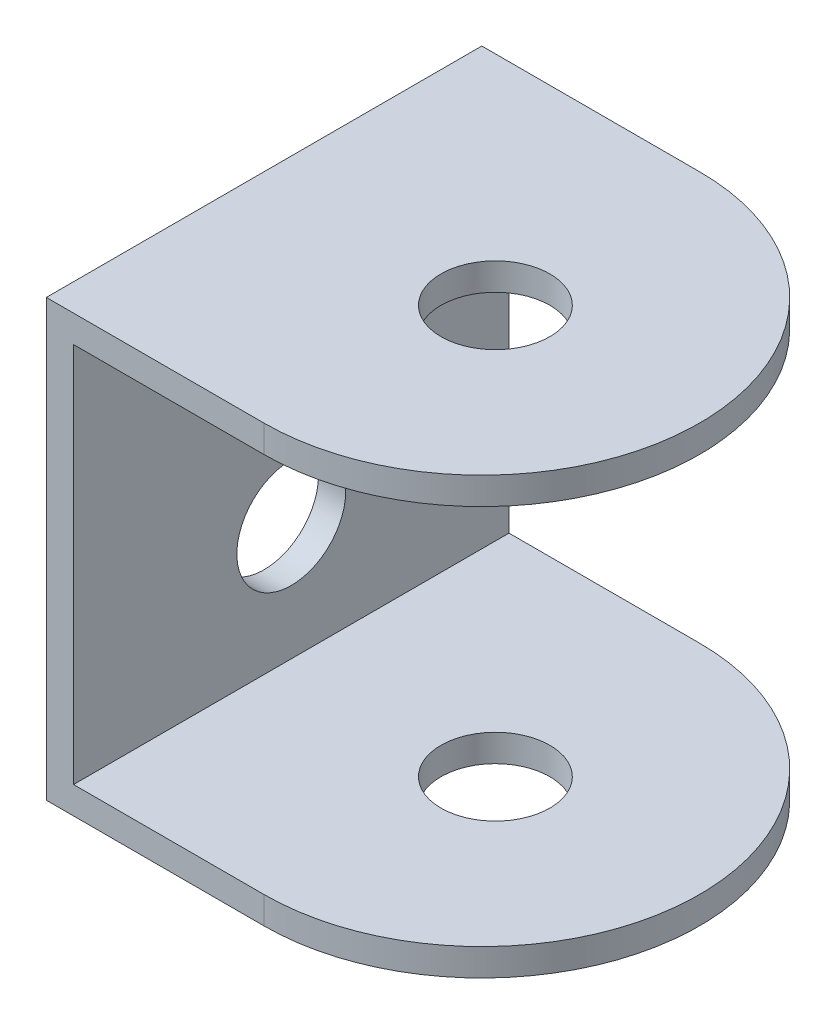
ISO-10303-21;
HEADER;
FILE_DESCRIPTION(('STEP AP214'),'2;1');
FILE_NAME('part.step','',(''),(''),'','','');
FILE_SCHEMA(('AUTOMOTIVE_DESIGN { 1 0 10303 214 1 1 1 1 }'));
ENDSEC;
DATA;
#1=APPLICATION_CONTEXT('core data for automotive mechanical design processes');
#2=APPLICATION_PROTOCOL_DEFINITION('international standard','automotive_design',2000,#1);
#3=PRODUCT_CONTEXT('',#1,'mechanical');
#4=PRODUCT('Part','Part','',(#3));
#5=PRODUCT_RELATED_PRODUCT_CATEGORY('part','',(#4));
#6=PRODUCT_DEFINITION_FORMATION('','',#4);
#7=PRODUCT_DEFINITION_CONTEXT('part definition',#1,'design');
#8=PRODUCT_DEFINITION('design','',#6,#7);
#9=PRODUCT_DEFINITION_SHAPE('','',#8);
#10=(LENGTH_UNIT() NAMED_UNIT(*) SI_UNIT(.MILLI.,.METRE.));
#11=(NAMED_UNIT(*) PLANE_ANGLE_UNIT() SI_UNIT($,.RADIAN.));
#12=(NAMED_UNIT(*) SI_UNIT($,.STERADIAN.) SOLID_ANGLE_UNIT());
#13=UNCERTAINTY_MEASURE_WITH_UNIT(LENGTH_MEASURE(1.E-05),#10,'distance_accuracy_value','');
#14=(GEOMETRIC_REPRESENTATION_CONTEXT(3) GLOBAL_UNCERTAINTY_ASSIGNED_CONTEXT((#13)) GLOBAL_UNIT_ASSIGNED_CONTEXT((#10,
#11,#12)) REPRESENTATION_CONTEXT('',''));
#15=CARTESIAN_POINT('',(0.,0.,0.));
#16=DIRECTION('',(0.,0.,1.));
#17=DIRECTION('',(1.,0.,0.));
#18=AXIS2_PLACEMENT_3D('',#15,#16,#17);
#19=CARTESIAN_POINT('',(0.,25.4,25.4));
#20=DIRECTION('',(0.,1.,0.));
#21=DIRECTION('',(0.,0.,1.));
#22=AXIS2_PLACEMENT_3D('',#19,#20,#21);
#23=PLANE('',#22);
#24=CARTESIAN_POINT('',(13.49375,25.4,12.7));
#25=DIRECTION('',(0.,1.,0.));
#26=DIRECTION('',(0.,0.,1.));
#27=AXIS2_PLACEMENT_3D('',#24,#25,#26);
#28=CIRCLE('',#27,3.175);
#29=CARTESIAN_POINT('',(13.49375,25.4,15.875));
#30=VERTEX_POINT('',#29);
#31=EDGE_CURVE('E184',#30,#30,#28,.T.);
#32=ORIENTED_EDGE('',*,*,#31,.F.);
#33=EDGE_LOOP('',(#32));
#34=FACE_BOUND('',#33,.T.);
#35=DIRECTION('',(1.,0.,0.));
#36=VECTOR('',#35,1.);
#37=CARTESIAN_POINT('',(0.,25.4,25.4));
#38=LINE('',#37,#36);
#39=CARTESIAN_POINT('',(0.,25.4,25.4));
#40=VERTEX_POINT('',#39);
#41=CARTESIAN_POINT('',(12.7,25.4,25.4));
#42=VERTEX_POINT('',#41);
#43=EDGE_CURVE('E180',#40,#42,#38,.T.);
#44=ORIENTED_EDGE('',*,*,#43,.T.);
#45=CARTESIAN_POINT('',(12.7,25.4,12.7));
#46=DIRECTION('',(0.,1.,0.));
#47=DIRECTION('',(0.,0.,1.));
#48=AXIS2_PLACEMENT_3D('',#45,#46,#47);
#49=CIRCLE('',#48,12.7);
#50=CARTESIAN_POINT('',(12.7,25.4,0.));
#51=VERTEX_POINT('',#50);
#52=EDGE_CURVE('E164',#42,#51,#49,.T.);
#53=ORIENTED_EDGE('',*,*,#52,.T.);
#54=DIRECTION('',(1.,0.,0.));
#55=VECTOR('',#54,1.);
#56=CARTESIAN_POINT('',(0.,25.4,0.));
#57=LINE('',#56,#55);
#58=CARTESIAN_POINT('',(0.,25.4,0.));
#59=VERTEX_POINT('',#58);
#60=EDGE_CURVE('E212',#59,#51,#57,.T.);
#61=ORIENTED_EDGE('',*,*,#60,.F.);
#62=DIRECTION('',(0.,0.,-1.));
#63=VECTOR('',#62,1.);
#64=CARTESIAN_POINT('',(0.,25.4,25.4));
#65=LINE('',#64,#63);
#66=EDGE_CURVE('E186',#40,#59,#65,.T.);
#67=ORIENTED_EDGE('',*,*,#66,.F.);
#68=EDGE_LOOP('',(#44,#53,#61,#67));
#69=FACE_BOUND('',#68,.T.);
#70=ADVANCED_FACE('F81',(#34,#69),#23,.T.);
#71=CARTESIAN_POINT('',(25.4,23.8125,25.4));
#72=DIRECTION('',(0.,-1.,0.));
#73=DIRECTION('',(0.,0.,-1.));
#74=AXIS2_PLACEMENT_3D('',#71,#72,#73);
#75=PLANE('',#74);
#76=CARTESIAN_POINT('',(13.49375,23.8125,12.7));
#77=DIRECTION('',(0.,-1.,0.));
#78=DIRECTION('',(0.,0.,-1.));
#79=AXIS2_PLACEMENT_3D('',#76,#77,#78);
#80=CIRCLE('',#79,3.175);
#81=CARTESIAN_POINT('',(13.49375,23.8125,9.525));
#82=VERTEX_POINT('',#81);
#83=EDGE_CURVE('E176',#82,#82,#80,.T.);
#84=ORIENTED_EDGE('',*,*,#83,.F.);
#85=EDGE_LOOP('',(#84));
#86=FACE_BOUND('',#85,.T.);
#87=CARTESIAN_POINT('',(12.7,23.8125,12.7));
#88=DIRECTION('',(0.,-1.,0.));
#89=DIRECTION('',(0.,0.,-1.));
#90=AXIS2_PLACEMENT_3D('',#87,#88,#89);
#91=CIRCLE('',#90,12.7);
#92=CARTESIAN_POINT('',(12.7,23.8125,0.));
#93=VERTEX_POINT('',#92);
#94=CARTESIAN_POINT('',(12.7,23.8125,25.4));
#95=VERTEX_POINT('',#94);
#96=EDGE_CURVE('E313',#93,#95,#91,.T.);
#97=ORIENTED_EDGE('',*,*,#96,.T.);
#98=DIRECTION('',(-1.,0.,0.));
#99=VECTOR('',#98,1.);
#100=CARTESIAN_POINT('',(25.4,23.8125,25.4));
#101=LINE('',#100,#99);
#102=CARTESIAN_POINT('',(1.5875,23.8125,25.4));
#103=VERTEX_POINT('',#102);
#104=EDGE_CURVE('E182',#95,#103,#101,.T.);
#105=ORIENTED_EDGE('',*,*,#104,.T.);
#106=DIRECTION('',(0.,0.,-1.));
#107=VECTOR('',#106,1.);
#108=CARTESIAN_POINT('',(1.5875,23.8125,25.4));
#109=LINE('',#108,#107);
#110=CARTESIAN_POINT('',(1.5875,23.8125,0.));
#111=VERTEX_POINT('',#110);
#112=EDGE_CURVE('E303',#103,#111,#109,.T.);
#113=ORIENTED_EDGE('',*,*,#112,.T.);
#114=DIRECTION('',(-1.,0.,0.));
#115=VECTOR('',#114,1.);
#116=CARTESIAN_POINT('',(25.4,23.8125,0.));
#117=LINE('',#116,#115);
#118=EDGE_CURVE('E310',#93,#111,#117,.T.);
#119=ORIENTED_EDGE('',*,*,#118,.F.);
#120=EDGE_LOOP('',(#97,#105,#113,#119));
#121=FACE_BOUND('',#120,.T.);
#122=ADVANCED_FACE('F257',(#86,#121),#75,.T.);
#123=CARTESIAN_POINT('',(0.,0.,25.4));
#124=DIRECTION('',(0.,1.,0.));
#125=DIRECTION('',(0.,0.,1.));
#126=AXIS2_PLACEMENT_3D('',#123,#124,#125);
#127=PLANE('',#126);
#128=CARTESIAN_POINT('',(13.49375,0.,12.7));
#129=DIRECTION('',(0.,1.,0.));
#130=DIRECTION('',(0.,0.,1.));
#131=AXIS2_PLACEMENT_3D('',#128,#129,#130);
#132=CIRCLE('',#131,3.175);
#133=CARTESIAN_POINT('',(13.49375,0.,15.875));
#134=VERTEX_POINT('',#133);
#135=EDGE_CURVE('E283',#134,#134,#132,.T.);
#136=ORIENTED_EDGE('',*,*,#135,.T.);
#137=EDGE_LOOP('',(#136));
#138=FACE_BOUND('',#137,.T.);
#139=DIRECTION('',(1.,0.,0.));
#140=VECTOR('',#139,1.);
#141=CARTESIAN_POINT('',(0.,0.,0.));
#142=LINE('',#141,#140);
#143=CARTESIAN_POINT('',(0.,0.,0.));
#144=VERTEX_POINT('',#143);
#145=CARTESIAN_POINT('',(12.7,0.,0.));
#146=VERTEX_POINT('',#145);
#147=EDGE_CURVE('E201',#144,#146,#142,.T.);
#148=ORIENTED_EDGE('',*,*,#147,.T.);
#149=CARTESIAN_POINT('',(12.7,0.,12.7));
#150=DIRECTION('',(0.,1.,0.));
#151=DIRECTION('',(0.,0.,1.));
#152=AXIS2_PLACEMENT_3D('',#149,#150,#151);
#153=CIRCLE('',#152,12.7);
#154=CARTESIAN_POINT('',(12.7,0.,25.4));
#155=VERTEX_POINT('',#154);
#156=EDGE_CURVE('E109',#146,#155,#153,.F.);
#157=ORIENTED_EDGE('',*,*,#156,.T.);
#158=DIRECTION('',(1.,0.,0.));
#159=VECTOR('',#158,1.);
#160=CARTESIAN_POINT('',(0.,0.,25.4));
#161=LINE('',#160,#159);
#162=CARTESIAN_POINT('',(0.,0.,25.4));
#163=VERTEX_POINT('',#162);
#164=EDGE_CURVE('E218',#163,#155,#161,.T.);
#165=ORIENTED_EDGE('',*,*,#164,.F.);
#166=DIRECTION('',(0.,0.,-1.));
#167=VECTOR('',#166,1.);
#168=CARTESIAN_POINT('',(0.,0.,25.4));
#169=LINE('',#168,#167);
#170=EDGE_CURVE('E194',#163,#144,#169,.T.);
#171=ORIENTED_EDGE('',*,*,#170,.T.);
#172=EDGE_LOOP('',(#148,#157,#165,#171));
#173=FACE_BOUND('',#172,.T.);
#174=ADVANCED_FACE('F263',(#138,#173),#127,.F.);
#175=CARTESIAN_POINT('',(0.,1.5875,25.4));
#176=DIRECTION('',(0.,1.,0.));
#177=DIRECTION('',(0.,0.,1.));
#178=AXIS2_PLACEMENT_3D('',#175,#176,#177);
#179=PLANE('',#178);
#180=CARTESIAN_POINT('',(13.49375,1.5875,12.7));
#181=DIRECTION('',(0.,1.,0.));
#182=DIRECTION('',(0.,0.,1.));
#183=AXIS2_PLACEMENT_3D('',#180,#181,#182);
#184=CIRCLE('',#183,3.175);
#185=CARTESIAN_POINT('',(13.49375,1.5875,15.875));
#186=VERTEX_POINT('',#185);
#187=EDGE_CURVE('E85',#186,#186,#184,.T.);
#188=ORIENTED_EDGE('',*,*,#187,.F.);
#189=EDGE_LOOP('',(#188));
#190=FACE_BOUND('',#189,.T.);
#191=CARTESIAN_POINT('',(12.7,1.5875,12.7));
#192=DIRECTION('',(0.,1.,0.));
#193=DIRECTION('',(0.,0.,1.));
#194=AXIS2_PLACEMENT_3D('',#191,#192,#193);
#195=CIRCLE('',#194,12.7);
#196=CARTESIAN_POINT('',(12.7,1.5875,25.4));
#197=VERTEX_POINT('',#196);
#198=CARTESIAN_POINT('',(12.7,1.5875,0.));
#199=VERTEX_POINT('',#198);
#200=EDGE_CURVE('E91',#197,#199,#195,.T.);
#201=ORIENTED_EDGE('',*,*,#200,.T.);
#202=DIRECTION('',(1.,0.,0.));
#203=VECTOR('',#202,1.);
#204=CARTESIAN_POINT('',(0.,1.5875,0.));
#205=LINE('',#204,#203);
#206=CARTESIAN_POINT('',(1.5875,1.5875,0.));
#207=VERTEX_POINT('',#206);
#208=EDGE_CURVE('E204',#207,#199,#205,.T.);
#209=ORIENTED_EDGE('',*,*,#208,.F.);
#210=DIRECTION('',(0.,0.,-1.));
#211=VECTOR('',#210,1.);
#212=CARTESIAN_POINT('',(1.5875,1.5875,25.4));
#213=LINE('',#212,#211);
#214=CARTESIAN_POINT('',(1.5875,1.5875,25.4));
#215=VERTEX_POINT('',#214);
#216=EDGE_CURVE('E223',#215,#207,#213,.T.);
#217=ORIENTED_EDGE('',*,*,#216,.F.);
#218=DIRECTION('',(1.,0.,0.));
#219=VECTOR('',#218,1.);
#220=CARTESIAN_POINT('',(0.,1.5875,25.4));
#221=LINE('',#220,#219);
#222=EDGE_CURVE('E197',#215,#197,#221,.T.);
#223=ORIENTED_EDGE('',*,*,#222,.T.);
#224=EDGE_LOOP('',(#201,#209,#217,#223));
#225=FACE_BOUND('',#224,.T.);
#226=ADVANCED_FACE('F237',(#190,#225),#179,.T.);
#227=CARTESIAN_POINT('',(1.5875,0.,25.4));
#228=DIRECTION('',(1.,0.,0.));
#229=DIRECTION('',(0.,0.,-1.));
#230=AXIS2_PLACEMENT_3D('',#227,#228,#229);
#231=PLANE('',#230);
#232=ORIENTED_EDGE('',*,*,#112,.F.);
#233=DIRECTION('',(0.,1.,0.));
#234=VECTOR('',#233,1.);
#235=CARTESIAN_POINT('',(1.5875,0.,25.4));
#236=LINE('',#235,#234);
#237=EDGE_CURVE('E190',#103,#215,#236,.F.);
#238=ORIENTED_EDGE('',*,*,#237,.T.);
#239=ORIENTED_EDGE('',*,*,#216,.T.);
#240=DIRECTION('',(0.,1.,0.));
#241=VECTOR('',#240,1.);
#242=CARTESIAN_POINT('',(1.5875,0.,0.));
#243=LINE('',#242,#241);
#244=EDGE_CURVE('E209',#111,#207,#243,.F.);
#245=ORIENTED_EDGE('',*,*,#244,.F.);
#246=EDGE_LOOP('',(#232,#238,#239,#245));
#247=FACE_BOUND('',#246,.T.);
#248=CARTESIAN_POINT('',(1.5875,8.46666666666667,12.7));
#249=DIRECTION('',(1.,0.,0.));
#250=DIRECTION('',(0.,0.,-1.));
#251=AXIS2_PLACEMENT_3D('',#248,#249,#250);
#252=CIRCLE('',#251,3.175);
#253=CARTESIAN_POINT('',(1.5875,8.46666666666667,9.525));
#254=VERTEX_POINT('',#253);
#255=EDGE_CURVE('E299',#254,#254,#252,.T.);
#256=ORIENTED_EDGE('',*,*,#255,.F.);
#257=EDGE_LOOP('',(#256));
#258=FACE_BOUND('',#257,.T.);
#259=CARTESIAN_POINT('',(1.5875,16.9333333333333,12.7));
#260=DIRECTION('',(1.,0.,0.));
#261=DIRECTION('',(0.,0.,-1.));
#262=AXIS2_PLACEMENT_3D('',#259,#260,#261);
#263=CIRCLE('',#262,3.175);
#264=CARTESIAN_POINT('',(1.5875,16.9333333333333,9.525));
#265=VERTEX_POINT('',#264);
#266=EDGE_CURVE('E291',#265,#265,#263,.T.);
#267=ORIENTED_EDGE('',*,*,#266,.F.);
#268=EDGE_LOOP('',(#267));
#269=FACE_BOUND('',#268,.T.);
#270=ADVANCED_FACE('F271',(#247,#258,#269),#231,.T.);
#271=CARTESIAN_POINT('',(0.,0.,25.4));
#272=DIRECTION('',(1.,0.,0.));
#273=DIRECTION('',(0.,0.,-1.));
#274=AXIS2_PLACEMENT_3D('',#271,#272,#273);
#275=PLANE('',#274);
#276=CARTESIAN_POINT('',(0.,8.46666666666667,12.7));
#277=DIRECTION('',(1.,0.,0.));
#278=DIRECTION('',(0.,0.,-1.));
#279=AXIS2_PLACEMENT_3D('',#276,#277,#278);
#280=CIRCLE('',#279,3.175);
#281=CARTESIAN_POINT('',(0.,8.46666666666667,9.525));
#282=VERTEX_POINT('',#281);
#283=EDGE_CURVE('E295',#282,#282,#280,.T.);
#284=ORIENTED_EDGE('',*,*,#283,.T.);
#285=EDGE_LOOP('',(#284));
#286=FACE_BOUND('',#285,.T.);
#287=CARTESIAN_POINT('',(0.,16.9333333333333,12.7));
#288=DIRECTION('',(1.,0.,0.));
#289=DIRECTION('',(0.,0.,-1.));
#290=AXIS2_PLACEMENT_3D('',#287,#288,#289);
#291=CIRCLE('',#290,3.175);
#292=CARTESIAN_POINT('',(0.,16.9333333333333,9.525));
#293=VERTEX_POINT('',#292);
#294=EDGE_CURVE('E205',#293,#293,#291,.T.);
#295=ORIENTED_EDGE('',*,*,#294,.T.);
#296=EDGE_LOOP('',(#295));
#297=FACE_BOUND('',#296,.T.);
#298=ORIENTED_EDGE('',*,*,#170,.F.);
#299=DIRECTION('',(0.,-1.,0.));
#300=VECTOR('',#299,1.);
#301=CARTESIAN_POINT('',(0.,0.,25.4));
#302=LINE('',#301,#300);
#303=EDGE_CURVE('E189',#40,#163,#302,.T.);
#304=ORIENTED_EDGE('',*,*,#303,.F.);
#305=ORIENTED_EDGE('',*,*,#66,.T.);
#306=DIRECTION('',(0.,-1.,0.));
#307=VECTOR('',#306,1.);
#308=CARTESIAN_POINT('',(0.,0.,0.));
#309=LINE('',#308,#307);
#310=EDGE_CURVE('E215',#59,#144,#309,.T.);
#311=ORIENTED_EDGE('',*,*,#310,.T.);
#312=EDGE_LOOP('',(#298,#304,#305,#311));
#313=FACE_BOUND('',#312,.T.);
#314=ADVANCED_FACE('F269',(#286,#297,#313),#275,.F.);
#315=CARTESIAN_POINT('',(0.,0.,25.4));
#316=DIRECTION('',(0.,0.,-1.));
#317=DIRECTION('',(-1.,0.,0.));
#318=AXIS2_PLACEMENT_3D('',#315,#316,#317);
#319=PLANE('',#318);
#320=ORIENTED_EDGE('',*,*,#104,.F.);
#321=DIRECTION('',(0.,1.,0.));
#322=VECTOR('',#321,1.);
#323=CARTESIAN_POINT('',(12.7,0.,25.4));
#324=LINE('',#323,#322);
#325=EDGE_CURVE('E167',#95,#42,#324,.T.);
#326=ORIENTED_EDGE('',*,*,#325,.T.);
#327=ORIENTED_EDGE('',*,*,#43,.F.);
#328=ORIENTED_EDGE('',*,*,#303,.T.);
#329=ORIENTED_EDGE('',*,*,#164,.T.);
#330=DIRECTION('',(0.,-1.,0.));
#331=VECTOR('',#330,1.);
#332=CARTESIAN_POINT('',(12.7,1.5875,25.4));
#333=LINE('',#332,#331);
#334=EDGE_CURVE('E12',#155,#197,#333,.F.);
#335=ORIENTED_EDGE('',*,*,#334,.T.);
#336=ORIENTED_EDGE('',*,*,#222,.F.);
#337=ORIENTED_EDGE('',*,*,#237,.F.);
#338=EDGE_LOOP('',(#320,#326,#327,#328,#329,#335,#336,#337));
#339=FACE_BOUND('',#338,.T.);
#340=ADVANCED_FACE('F179',(#339),#319,.F.);
#341=CARTESIAN_POINT('',(0.,0.,0.));
#342=DIRECTION('',(0.,0.,-1.));
#343=DIRECTION('',(-1.,0.,0.));
#344=AXIS2_PLACEMENT_3D('',#341,#342,#343);
#345=PLANE('',#344);
#346=DIRECTION('',(0.,1.,0.));
#347=VECTOR('',#346,1.);
#348=CARTESIAN_POINT('',(12.7,0.,0.));
#349=LINE('',#348,#347);
#350=EDGE_CURVE('E170',#93,#51,#349,.T.);
#351=ORIENTED_EDGE('',*,*,#350,.F.);
#352=ORIENTED_EDGE('',*,*,#118,.T.);
#353=ORIENTED_EDGE('',*,*,#244,.T.);
#354=ORIENTED_EDGE('',*,*,#208,.T.);
#355=DIRECTION('',(0.,-1.,0.));
#356=VECTOR('',#355,1.);
#357=CARTESIAN_POINT('',(12.7,0.,0.));
#358=LINE('',#357,#356);
#359=EDGE_CURVE('E227',#199,#146,#358,.T.);
#360=ORIENTED_EDGE('',*,*,#359,.T.);
#361=ORIENTED_EDGE('',*,*,#147,.F.);
#362=ORIENTED_EDGE('',*,*,#310,.F.);
#363=ORIENTED_EDGE('',*,*,#60,.T.);
#364=EDGE_LOOP('',(#351,#352,#353,#354,#360,#361,#362,#363));
#365=FACE_BOUND('',#364,.T.);
#366=ADVANCED_FACE('F242',(#365),#345,.T.);
#367=CARTESIAN_POINT('',(0.,16.9333333333333,12.7));
#368=DIRECTION('',(1.,0.,0.));
#369=DIRECTION('',(0.,0.,-1.));
#370=AXIS2_PLACEMENT_3D('',#367,#368,#369);
#371=CYLINDRICAL_SURFACE('',#370,3.175);
#372=ORIENTED_EDGE('',*,*,#294,.F.);
#373=EDGE_LOOP('',(#372));
#374=FACE_BOUND('',#373,.T.);
#375=ORIENTED_EDGE('',*,*,#266,.T.);
#376=EDGE_LOOP('',(#375));
#377=FACE_BOUND('',#376,.T.);
#378=ADVANCED_FACE('F253',(#374,#377),#371,.F.);
#379=CARTESIAN_POINT('',(0.,8.46666666666667,12.7));
#380=DIRECTION('',(1.,0.,0.));
#381=DIRECTION('',(0.,0.,-1.));
#382=AXIS2_PLACEMENT_3D('',#379,#380,#381);
#383=CYLINDRICAL_SURFACE('',#382,3.175);
#384=ORIENTED_EDGE('',*,*,#283,.F.);
#385=EDGE_LOOP('',(#384));
#386=FACE_BOUND('',#385,.T.);
#387=ORIENTED_EDGE('',*,*,#255,.T.);
#388=EDGE_LOOP('',(#387));
#389=FACE_BOUND('',#388,.T.);
#390=ADVANCED_FACE('F246',(#386,#389),#383,.F.);
#391=CARTESIAN_POINT('',(12.7,1.5875,12.7));
#392=DIRECTION('',(0.,1.,0.));
#393=DIRECTION('',(0.,0.,1.));
#394=AXIS2_PLACEMENT_3D('',#391,#392,#393);
#395=CYLINDRICAL_SURFACE('',#394,12.7);
#396=ORIENTED_EDGE('',*,*,#334,.F.);
#397=ORIENTED_EDGE('',*,*,#156,.F.);
#398=ORIENTED_EDGE('',*,*,#359,.F.);
#399=ORIENTED_EDGE('',*,*,#200,.F.);
#400=EDGE_LOOP('',(#396,#397,#398,#399));
#401=FACE_BOUND('',#400,.T.);
#402=ADVANCED_FACE('F83',(#401),#395,.T.);
#403=CARTESIAN_POINT('',(12.7,0.,12.7));
#404=DIRECTION('',(0.,1.,0.));
#405=DIRECTION('',(0.,0.,1.));
#406=AXIS2_PLACEMENT_3D('',#403,#404,#405);
#407=CYLINDRICAL_SURFACE('',#406,12.7);
#408=ORIENTED_EDGE('',*,*,#350,.T.);
#409=ORIENTED_EDGE('',*,*,#52,.F.);
#410=ORIENTED_EDGE('',*,*,#325,.F.);
#411=ORIENTED_EDGE('',*,*,#96,.F.);
#412=EDGE_LOOP('',(#408,#409,#410,#411));
#413=FACE_BOUND('',#412,.T.);
#414=ADVANCED_FACE('F166',(#413),#407,.T.);
#415=CARTESIAN_POINT('',(13.49375,0.,12.7));
#416=DIRECTION('',(0.,1.,0.));
#417=DIRECTION('',(0.,0.,1.));
#418=AXIS2_PLACEMENT_3D('',#415,#416,#417);
#419=CYLINDRICAL_SURFACE('',#418,3.175);
#420=ORIENTED_EDGE('',*,*,#187,.T.);
#421=EDGE_LOOP('',(#420));
#422=FACE_BOUND('',#421,.T.);
#423=ORIENTED_EDGE('',*,*,#135,.F.);
#424=EDGE_LOOP('',(#423));
#425=FACE_BOUND('',#424,.T.);
#426=ADVANCED_FACE('F251',(#422,#425),#419,.F.);
#427=ORIENTED_EDGE('',*,*,#83,.T.);
#428=EDGE_LOOP('',(#427));
#429=FACE_BOUND('',#428,.T.);
#430=ORIENTED_EDGE('',*,*,#31,.T.);
#431=EDGE_LOOP('',(#430));
#432=FACE_BOUND('',#431,.T.);
#433=ADVANCED_FACE('F333',(#429,#432),#419,.F.);
#434=CLOSED_SHELL('',(#70,#122,#174,#226,#270,#314,#340,#366,#378,#390,#402,#414,#426,#433));
#435=MANIFOLD_SOLID_BREP('B2',#434);
#436=ADVANCED_BREP_SHAPE_REPRESENTATION('',(#18,#435),#14);
#437=SHAPE_DEFINITION_REPRESENTATION(#9,#436);
ENDSEC;
END-ISO-10303-21;
